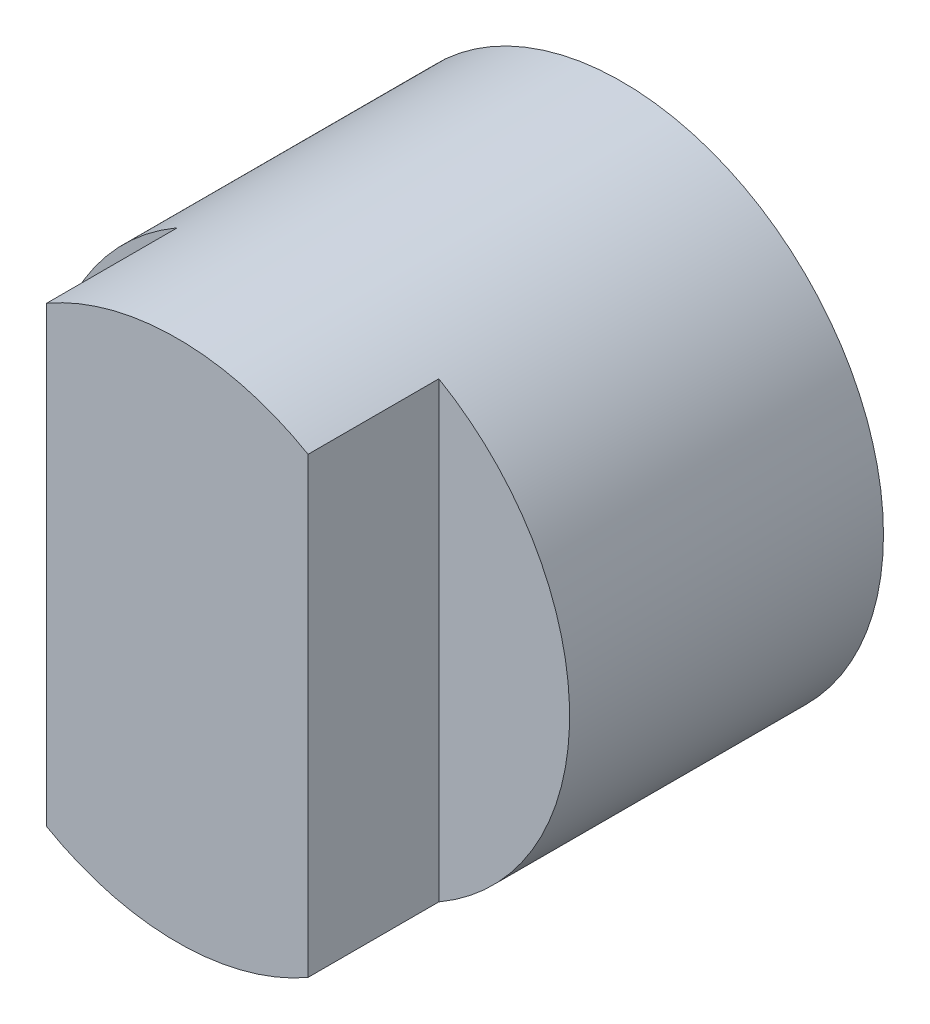
ISO-10303-21;
HEADER;
FILE_DESCRIPTION(('STEP AP214'),'2;1');
FILE_NAME('part.step','',(''),(''),'','','');
FILE_SCHEMA(('AUTOMOTIVE_DESIGN { 1 0 10303 214 1 1 1 1 }'));
ENDSEC;
DATA;
#1=APPLICATION_CONTEXT('core data for automotive mechanical design processes');
#2=APPLICATION_PROTOCOL_DEFINITION('international standard','automotive_design',2000,#1);
#3=PRODUCT_CONTEXT('',#1,'mechanical');
#4=PRODUCT('Part','Part','',(#3));
#5=PRODUCT_RELATED_PRODUCT_CATEGORY('part','',(#4));
#6=PRODUCT_DEFINITION_FORMATION('','',#4);
#7=PRODUCT_DEFINITION_CONTEXT('part definition',#1,'design');
#8=PRODUCT_DEFINITION('design','',#6,#7);
#9=PRODUCT_DEFINITION_SHAPE('','',#8);
#10=(LENGTH_UNIT() NAMED_UNIT(*) SI_UNIT(.MILLI.,.METRE.));
#11=(NAMED_UNIT(*) PLANE_ANGLE_UNIT() SI_UNIT($,.RADIAN.));
#12=(NAMED_UNIT(*) SI_UNIT($,.STERADIAN.) SOLID_ANGLE_UNIT());
#13=UNCERTAINTY_MEASURE_WITH_UNIT(LENGTH_MEASURE(1.E-05),#10,'distance_accuracy_value','');
#14=(GEOMETRIC_REPRESENTATION_CONTEXT(3) GLOBAL_UNCERTAINTY_ASSIGNED_CONTEXT((#13)) GLOBAL_UNIT_ASSIGNED_CONTEXT((#10,
#11,#12)) REPRESENTATION_CONTEXT('',''));
#15=CARTESIAN_POINT('',(0.,0.,0.));
#16=DIRECTION('',(0.,0.,1.));
#17=DIRECTION('',(1.,0.,0.));
#18=AXIS2_PLACEMENT_3D('',#15,#16,#17);
#19=CARTESIAN_POINT('',(0.,0.,17.));
#20=DIRECTION('',(0.,0.,-1.));
#21=DIRECTION('',(-1.,0.,0.));
#22=AXIS2_PLACEMENT_3D('',#19,#20,#21);
#23=CYLINDRICAL_SURFACE('',#22,10.);
#24=CARTESIAN_POINT('',(0.,-10.,8.5));
#25=CARTESIAN_POINT('',(-0.0837515444816421,-9.99999865771297,8.49999654618476));
#26=CARTESIAN_POINT('',(-0.167551685082132,-9.9989368253704,8.49296199915937));
#27=CARTESIAN_POINT('',(-0.332809627994913,-9.99480315973187,8.46501680001725));
#28=CARTESIAN_POINT('',(-0.414265068974229,-9.99172936938473,8.44409263705511));
#29=CARTESIAN_POINT('',(-0.57241808622186,-9.98391721219526,8.38900749503238));
#30=CARTESIAN_POINT('',(-0.649119207826799,-9.97918010370919,8.35485652049405));
#31=CARTESIAN_POINT('',(-0.795690428635254,-9.96856475911724,8.27431162058314));
#32=CARTESIAN_POINT('',(-0.865561474725189,-9.96268668152773,8.22791939558264));
#33=CARTESIAN_POINT('',(-0.997046719562126,-9.95039170991452,8.12382273506013));
#34=CARTESIAN_POINT('',(-1.0585998322255,-9.94397133890331,8.0660415437918));
#35=CARTESIAN_POINT('',(-1.17117490668948,-9.93134261133238,7.94097231110613));
#36=CARTESIAN_POINT('',(-1.22219626272936,-9.92513426698505,7.87368372322148));
#37=CARTESIAN_POINT('',(-1.31249729499943,-9.91359877458726,7.73109935647751));
#38=CARTESIAN_POINT('',(-1.35171787037205,-9.90827611975031,7.65576575301866));
#39=CARTESIAN_POINT('',(-1.41692632171056,-9.89916211306268,7.49948717935457));
#40=CARTESIAN_POINT('',(-1.44291491889163,-9.89537067775449,7.41854251525611));
#41=CARTESIAN_POINT('',(-1.48073198798911,-9.88978256218673,7.25398195812829));
#42=CARTESIAN_POINT('',(-1.49266503640518,-9.8879711574125,7.17039060659198));
#43=CARTESIAN_POINT('',(-1.50235624033932,-9.88650348970582,7.00237383401272));
#44=CARTESIAN_POINT('',(-1.50011520973796,-9.88684710303147,6.91794846113751));
#45=CARTESIAN_POINT('',(-1.48160733250788,-9.88963718352409,6.75139891980586));
#46=CARTESIAN_POINT('',(-1.4654569592775,-9.89206618761549,6.6692614735152));
#47=CARTESIAN_POINT('',(-1.41977117403734,-9.89872608126367,6.50887563112847));
#48=CARTESIAN_POINT('',(-1.39023538337812,-9.90295702179379,6.43062734511926));
#49=CARTESIAN_POINT('',(-1.31849603529736,-9.91276335545481,6.27988662871714));
#50=CARTESIAN_POINT('',(-1.27624314283198,-9.91834396766526,6.20741803090761));
#51=CARTESIAN_POINT('',(-1.18030413128955,-9.93021707574548,6.07055540421807));
#52=CARTESIAN_POINT('',(-1.12661726182478,-9.93650961832501,6.00616190573063));
#53=CARTESIAN_POINT('',(-1.00869493078248,-9.94917473056209,5.88660233926028));
#54=CARTESIAN_POINT('',(-0.944359329642002,-9.95554747112815,5.83153500971366));
#55=CARTESIAN_POINT('',(-0.807307089894187,-9.96759647648462,5.73296406549274));
#56=CARTESIAN_POINT('',(-0.734590414588171,-9.9732727382251,5.6894605014561));
#57=CARTESIAN_POINT('',(-0.582754598213687,-9.98329515585393,5.61524691350045));
#58=CARTESIAN_POINT('',(-0.503631677836781,-9.98764051925428,5.5845445081597));
#59=CARTESIAN_POINT('',(-0.341273182487061,-9.99450490557069,5.53689061031463));
#60=CARTESIAN_POINT('',(-0.258037885952601,-9.99702405195467,5.51993818818443));
#61=CARTESIAN_POINT('',(-0.0906695676436464,-9.99993581133871,5.50039677018331));
#62=CARTESIAN_POINT('',(-0.00655273187047033,-10.0003485209039,5.49767202862068));
#63=CARTESIAN_POINT('',(0.160936677662283,-9.99905561015226,5.50630300531102));
#64=CARTESIAN_POINT('',(0.244309274381877,-9.99735005541369,5.5176582876681));
#65=CARTESIAN_POINT('',(0.407532387431408,-9.99202468615333,5.55401410017754));
#66=CARTESIAN_POINT('',(0.487397963079838,-9.98841415207984,5.57894849603085));
#67=CARTESIAN_POINT('',(0.641814958642999,-9.97968235658369,5.64168499746176));
#68=CARTESIAN_POINT('',(0.716366128795099,-9.97456102421565,5.67948770733363));
#69=CARTESIAN_POINT('',(0.858634979291921,-9.96332682468686,5.76720622456386));
#70=CARTESIAN_POINT('',(0.926299009891566,-9.95720701626745,5.81720814001277));
#71=CARTESIAN_POINT('',(1.05232367317771,-9.94467863012165,5.92778581162874));
#72=CARTESIAN_POINT('',(1.1106837647934,-9.93827003562867,5.98836218232465));
#73=CARTESIAN_POINT('',(1.21693784957195,-9.92582264304494,6.11897353317649));
#74=CARTESIAN_POINT('',(1.26474084747421,-9.91978736017588,6.18908292519477));
#75=CARTESIAN_POINT('',(1.34789129270584,-9.90883219104903,6.33641604051177));
#76=CARTESIAN_POINT('',(1.38323907656436,-9.90391227465628,6.41363957152147));
#77=CARTESIAN_POINT('',(1.44033467323943,-9.89577033008645,6.57273753362313));
#78=CARTESIAN_POINT('',(1.46213037141635,-9.89254233006438,6.65459446097124));
#79=CARTESIAN_POINT('',(1.49165549501586,-9.88813382297802,6.82085901543511));
#80=CARTESIAN_POINT('',(1.49938589183067,-9.88695317451771,6.90526646599467));
#81=CARTESIAN_POINT('',(1.5005378666944,-9.88677832610841,7.07332906331578));
#82=CARTESIAN_POINT('',(1.49410252167313,-9.88776226333502,7.15698324175692));
#83=CARTESIAN_POINT('',(1.46741229544379,-9.89175820611174,7.32200526332352));
#84=CARTESIAN_POINT('',(1.44715743638627,-9.89477020841118,7.40337311011339));
#85=CARTESIAN_POINT('',(1.39345373518665,-9.90247526112297,7.56147308223432));
#86=CARTESIAN_POINT('',(1.36001489324314,-9.90716703716075,7.63820867043344));
#87=CARTESIAN_POINT('',(1.28090667642309,-9.91770454557702,7.7850036338024));
#88=CARTESIAN_POINT('',(1.23523688741502,-9.92355031702724,7.85506278280364));
#89=CARTESIAN_POINT('',(1.13244337659164,-9.93580743364938,7.98724305797517));
#90=CARTESIAN_POINT('',(1.07521369039806,-9.94222367881967,8.04928133324707));
#91=CARTESIAN_POINT('',(0.951148841082835,-9.95485788826636,8.16292455478782));
#92=CARTESIAN_POINT('',(0.884311448350942,-9.96107580610759,8.21452707257616));
#93=CARTESIAN_POINT('',(0.742495707543722,-9.9726518579052,8.30608767660736));
#94=CARTESIAN_POINT('',(0.667474576764762,-9.9780050712882,8.34598010921475));
#95=CARTESIAN_POINT('',(0.51175187024872,-9.98720028802959,8.41253851675805));
#96=CARTESIAN_POINT('',(0.431056277096705,-9.99104385565757,8.43921819005369));
#97=CARTESIAN_POINT('',(0.29166572788933,-9.99590939261505,8.47254134271011));
#98=CARTESIAN_POINT('',(0.23383113349528,-9.99743549179557,8.48282260153881));
#99=CARTESIAN_POINT('',(0.117338971600126,-9.99948125947896,8.49655309771264));
#100=CARTESIAN_POINT('',(0.0586814143344177,-10.0000009404877,8.50000241995255));
#101=CARTESIAN_POINT('',(0.,-10.,8.5));
#102=B_SPLINE_CURVE_WITH_KNOTS('',3,(#24,#25,#26,#27,#28,#29,#30,#31,#32,#33,#34,#35,#36,#37,
#38,#39,#40,#41,#42,#43,#44,#45,#46,#47,#48,#49,#50,#51,#52,#53,#54,#55,#56,#57,#58,#59,#60,#61,
#62,#63,#64,#65,#66,#67,#68,#69,#70,#71,#72,#73,#74,#75,#76,#77,#78,#79,#80,#81,#82,#83,#84,#85,
#86,#87,#88,#89,#90,#91,#92,#93,#94,#95,#96,#97,#98,#99,#100,#101),.UNSPECIFIED.,.T.,.F.,(4,2,2,
2,2,2,2,2,2,2,2,2,2,2,2,2,2,2,2,2,2,2,2,2,2,2,2,2,2,2,2,2,2,2,2,2,2,2,4),(0.,0.251040205031663,
0.50232496292915,0.753420023583238,1.0044802241976,1.25729416136843,1.5101226357258,
1.76419702395375,2.01825756225506,2.27041564605924,2.52255925098982,2.77261177195746,
3.02267136690361,3.27371383476159,3.52477278308534,3.77834291255409,4.03191415238668,
4.28563608984874,4.53934087193401,4.79062058544255,5.04189251991155,5.29195148965948,
5.54202220376273,5.79391188036907,6.0458162002863,6.29981366584672,6.55380426808832,
6.80689223457168,7.05996272137177,7.31048888261064,7.56101464229564,7.81135073984147,
8.0616953146688,8.31444829965721,8.56726003468733,8.82146323384733,9.07540233261441,
9.25129851978808,9.42719252123291),.UNSPECIFIED.);
#103=CARTESIAN_POINT('',(0.,-10.,8.5));
#104=VERTEX_POINT('',#103);
#105=EDGE_CURVE('E103',#104,#104,#102,.T.);
#106=ORIENTED_EDGE('',*,*,#105,.F.);
#107=EDGE_LOOP('',(#106));
#108=FACE_BOUND('',#107,.T.);
#109=CARTESIAN_POINT('',(0.,0.,17.));
#110=DIRECTION('',(0.,0.,1.));
#111=DIRECTION('',(1.,0.,0.));
#112=AXIS2_PLACEMENT_3D('',#109,#110,#111);
#113=CIRCLE('',#112,10.);
#114=CARTESIAN_POINT('',(-5.,-8.66025403784439,17.));
#115=VERTEX_POINT('',#114);
#116=CARTESIAN_POINT('',(5.,-8.66025403784439,17.));
#117=VERTEX_POINT('',#116);
#118=EDGE_CURVE('E38',#115,#117,#113,.T.);
#119=ORIENTED_EDGE('',*,*,#118,.F.);
#120=DIRECTION('',(0.,0.,1.));
#121=VECTOR('',#120,1.);
#122=CARTESIAN_POINT('',(-5.,-8.66025403784439,12.));
#123=LINE('',#122,#121);
#124=CARTESIAN_POINT('',(-5.,-8.66025403784439,12.));
#125=VERTEX_POINT('',#124);
#126=EDGE_CURVE('E53',#125,#115,#123,.T.);
#127=ORIENTED_EDGE('',*,*,#126,.F.);
#128=CARTESIAN_POINT('',(0.,0.,12.));
#129=DIRECTION('',(0.,0.,1.));
#130=DIRECTION('',(1.,0.,0.));
#131=AXIS2_PLACEMENT_3D('',#128,#129,#130);
#132=CIRCLE('',#131,10.);
#133=CARTESIAN_POINT('',(-5.,8.66025403784439,12.));
#134=VERTEX_POINT('',#133);
#135=EDGE_CURVE('E107',#134,#125,#132,.T.);
#136=ORIENTED_EDGE('',*,*,#135,.F.);
#137=DIRECTION('',(0.,0.,1.));
#138=VECTOR('',#137,1.);
#139=CARTESIAN_POINT('',(-5.,8.66025403784439,12.));
#140=LINE('',#139,#138);
#141=CARTESIAN_POINT('',(-5.,8.66025403784439,17.));
#142=VERTEX_POINT('',#141);
#143=EDGE_CURVE('E113',#134,#142,#140,.T.);
#144=ORIENTED_EDGE('',*,*,#143,.T.);
#145=CARTESIAN_POINT('',(5.,8.66025403784439,17.));
#146=VERTEX_POINT('',#145);
#147=EDGE_CURVE('E11',#146,#142,#113,.T.);
#148=ORIENTED_EDGE('',*,*,#147,.F.);
#149=DIRECTION('',(0.,0.,1.));
#150=VECTOR('',#149,1.);
#151=CARTESIAN_POINT('',(5.,8.66025403784439,12.));
#152=LINE('',#151,#150);
#153=CARTESIAN_POINT('',(5.,8.66025403784439,12.));
#154=VERTEX_POINT('',#153);
#155=EDGE_CURVE('E123',#154,#146,#152,.T.);
#156=ORIENTED_EDGE('',*,*,#155,.F.);
#157=CARTESIAN_POINT('',(0.,0.,12.));
#158=DIRECTION('',(0.,0.,1.));
#159=DIRECTION('',(1.,0.,0.));
#160=AXIS2_PLACEMENT_3D('',#157,#158,#159);
#161=CIRCLE('',#160,10.);
#162=CARTESIAN_POINT('',(5.,-8.66025403784439,12.));
#163=VERTEX_POINT('',#162);
#164=EDGE_CURVE('E118',#163,#154,#161,.T.);
#165=ORIENTED_EDGE('',*,*,#164,.F.);
#166=DIRECTION('',(0.,0.,1.));
#167=VECTOR('',#166,1.);
#168=CARTESIAN_POINT('',(5.,-8.66025403784439,12.));
#169=LINE('',#168,#167);
#170=EDGE_CURVE('E126',#163,#117,#169,.T.);
#171=ORIENTED_EDGE('',*,*,#170,.T.);
#172=EDGE_LOOP('',(#119,#127,#136,#144,#148,#156,#165,#171));
#173=FACE_BOUND('',#172,.T.);
#174=CARTESIAN_POINT('',(0.,0.,0.));
#175=DIRECTION('',(0.,0.,1.));
#176=DIRECTION('',(1.,0.,0.));
#177=AXIS2_PLACEMENT_3D('',#174,#175,#176);
#178=CIRCLE('',#177,10.);
#179=CARTESIAN_POINT('',(10.,0.,0.));
#180=VERTEX_POINT('',#179);
#181=EDGE_CURVE('E33',#180,#180,#178,.T.);
#182=ORIENTED_EDGE('',*,*,#181,.T.);
#183=EDGE_LOOP('',(#182));
#184=FACE_BOUND('',#183,.T.);
#185=ADVANCED_FACE('F30',(#108,#173,#184),#23,.T.);
#186=CARTESIAN_POINT('',(0.,0.,17.));
#187=DIRECTION('',(0.,0.,1.));
#188=DIRECTION('',(1.,0.,0.));
#189=AXIS2_PLACEMENT_3D('',#186,#187,#188);
#190=PLANE('',#189);
#191=DIRECTION('',(0.,1.,0.));
#192=VECTOR('',#191,1.);
#193=CARTESIAN_POINT('',(-5.,8.66025403784439,17.));
#194=LINE('',#193,#192);
#195=EDGE_CURVE('E105',#115,#142,#194,.T.);
#196=ORIENTED_EDGE('',*,*,#195,.F.);
#197=ORIENTED_EDGE('',*,*,#118,.T.);
#198=DIRECTION('',(0.,-1.,0.));
#199=VECTOR('',#198,1.);
#200=CARTESIAN_POINT('',(5.,8.66025403784439,17.));
#201=LINE('',#200,#199);
#202=EDGE_CURVE('E116',#146,#117,#201,.T.);
#203=ORIENTED_EDGE('',*,*,#202,.F.);
#204=ORIENTED_EDGE('',*,*,#147,.T.);
#205=EDGE_LOOP('',(#196,#197,#203,#204));
#206=FACE_BOUND('',#205,.T.);
#207=ADVANCED_FACE('F138',(#206),#190,.T.);
#208=CARTESIAN_POINT('',(0.,0.,0.));
#209=DIRECTION('',(0.,0.,1.));
#210=DIRECTION('',(1.,0.,0.));
#211=AXIS2_PLACEMENT_3D('',#208,#209,#210);
#212=PLANE('',#211);
#213=DIRECTION('',(-1.,0.,0.));
#214=VECTOR('',#213,1.);
#215=CARTESIAN_POINT('',(0.,-2.725,0.));
#216=LINE('',#215,#214);
#217=CARTESIAN_POINT('',(1.62941707368003,-2.725,0.));
#218=VERTEX_POINT('',#217);
#219=CARTESIAN_POINT('',(-1.62941707368003,-2.725,0.));
#220=VERTEX_POINT('',#219);
#221=EDGE_CURVE('E95',#218,#220,#216,.T.);
#222=ORIENTED_EDGE('',*,*,#221,.F.);
#223=CARTESIAN_POINT('',(0.,0.,0.));
#224=DIRECTION('',(0.,0.,-1.));
#225=DIRECTION('',(-1.,0.,0.));
#226=AXIS2_PLACEMENT_3D('',#223,#224,#225);
#227=CIRCLE('',#226,3.175);
#228=EDGE_CURVE('E45',#220,#218,#227,.T.);
#229=ORIENTED_EDGE('',*,*,#228,.F.);
#230=EDGE_LOOP('',(#222,#229));
#231=FACE_BOUND('',#230,.T.);
#232=ORIENTED_EDGE('',*,*,#181,.F.);
#233=EDGE_LOOP('',(#232));
#234=FACE_BOUND('',#233,.T.);
#235=ADVANCED_FACE('F160',(#231,#234),#212,.F.);
#236=CARTESIAN_POINT('',(5.,8.66025403784439,12.));
#237=DIRECTION('',(-1.,0.,0.));
#238=DIRECTION('',(0.,0.,1.));
#239=AXIS2_PLACEMENT_3D('',#236,#237,#238);
#240=PLANE('',#239);
#241=ORIENTED_EDGE('',*,*,#202,.T.);
#242=ORIENTED_EDGE('',*,*,#170,.F.);
#243=DIRECTION('',(0.,-1.,0.));
#244=VECTOR('',#243,1.);
#245=CARTESIAN_POINT('',(5.,8.66025403784439,12.));
#246=LINE('',#245,#244);
#247=EDGE_CURVE('E120',#154,#163,#246,.T.);
#248=ORIENTED_EDGE('',*,*,#247,.F.);
#249=ORIENTED_EDGE('',*,*,#155,.T.);
#250=EDGE_LOOP('',(#241,#242,#248,#249));
#251=FACE_BOUND('',#250,.T.);
#252=ADVANCED_FACE('F133',(#251),#240,.F.);
#253=CARTESIAN_POINT('',(0.,0.,12.));
#254=DIRECTION('',(0.,0.,1.));
#255=DIRECTION('',(1.,0.,0.));
#256=AXIS2_PLACEMENT_3D('',#253,#254,#255);
#257=PLANE('',#256);
#258=ORIENTED_EDGE('',*,*,#164,.T.);
#259=ORIENTED_EDGE('',*,*,#247,.T.);
#260=EDGE_LOOP('',(#258,#259));
#261=FACE_BOUND('',#260,.T.);
#262=ADVANCED_FACE('F152',(#261),#257,.T.);
#263=CARTESIAN_POINT('',(-5.,8.66025403784439,12.));
#264=DIRECTION('',(1.,0.,0.));
#265=DIRECTION('',(0.,0.,-1.));
#266=AXIS2_PLACEMENT_3D('',#263,#264,#265);
#267=PLANE('',#266);
#268=ORIENTED_EDGE('',*,*,#195,.T.);
#269=ORIENTED_EDGE('',*,*,#143,.F.);
#270=DIRECTION('',(0.,1.,0.));
#271=VECTOR('',#270,1.);
#272=CARTESIAN_POINT('',(-5.,8.66025403784439,12.));
#273=LINE('',#272,#271);
#274=EDGE_CURVE('E109',#125,#134,#273,.T.);
#275=ORIENTED_EDGE('',*,*,#274,.F.);
#276=ORIENTED_EDGE('',*,*,#126,.T.);
#277=EDGE_LOOP('',(#268,#269,#275,#276));
#278=FACE_BOUND('',#277,.T.);
#279=ADVANCED_FACE('F142',(#278),#267,.F.);
#280=CARTESIAN_POINT('',(0.,0.,12.));
#281=DIRECTION('',(0.,0.,1.));
#282=DIRECTION('',(1.,0.,0.));
#283=AXIS2_PLACEMENT_3D('',#280,#281,#282);
#284=PLANE('',#283);
#285=ORIENTED_EDGE('',*,*,#135,.T.);
#286=ORIENTED_EDGE('',*,*,#274,.T.);
#287=EDGE_LOOP('',(#285,#286));
#288=FACE_BOUND('',#287,.T.);
#289=ADVANCED_FACE('F144',(#288),#284,.T.);
#290=CARTESIAN_POINT('',(0.,0.,15.));
#291=DIRECTION('',(0.,0.,-1.));
#292=DIRECTION('',(-1.,0.,0.));
#293=AXIS2_PLACEMENT_3D('',#290,#291,#292);
#294=CYLINDRICAL_SURFACE('',#293,3.175);
#295=ORIENTED_EDGE('',*,*,#228,.T.);
#296=DIRECTION('',(0.,0.,-1.));
#297=VECTOR('',#296,1.);
#298=CARTESIAN_POINT('',(1.62941707368003,-2.725,15.));
#299=LINE('',#298,#297);
#300=CARTESIAN_POINT('',(1.62941707368003,-2.725,15.));
#301=VERTEX_POINT('',#300);
#302=EDGE_CURVE('E96',#301,#218,#299,.T.);
#303=ORIENTED_EDGE('',*,*,#302,.F.);
#304=CARTESIAN_POINT('',(0.,0.,15.));
#305=DIRECTION('',(0.,0.,-1.));
#306=DIRECTION('',(-1.,0.,0.));
#307=AXIS2_PLACEMENT_3D('',#304,#305,#306);
#308=CIRCLE('',#307,3.175);
#309=CARTESIAN_POINT('',(-1.62941707368003,-2.725,15.));
#310=VERTEX_POINT('',#309);
#311=EDGE_CURVE('E88',#310,#301,#308,.T.);
#312=ORIENTED_EDGE('',*,*,#311,.F.);
#313=DIRECTION('',(0.,0.,-1.));
#314=VECTOR('',#313,1.);
#315=CARTESIAN_POINT('',(-1.62941707368003,-2.725,15.));
#316=LINE('',#315,#314);
#317=EDGE_CURVE('E92',#310,#220,#316,.T.);
#318=ORIENTED_EDGE('',*,*,#317,.T.);
#319=EDGE_LOOP('',(#295,#303,#312,#318));
#320=FACE_BOUND('',#319,.T.);
#321=ADVANCED_FACE('F98',(#320),#294,.F.);
#322=CARTESIAN_POINT('',(0.,-2.725,15.));
#323=DIRECTION('',(0.,-1.,0.));
#324=DIRECTION('',(0.,0.,-1.));
#325=AXIS2_PLACEMENT_3D('',#322,#323,#324);
#326=PLANE('',#325);
#327=CARTESIAN_POINT('',(0.,-2.725,7.));
#328=DIRECTION('',(0.,1.,0.));
#329=DIRECTION('',(0.,0.,1.));
#330=AXIS2_PLACEMENT_3D('',#327,#328,#329);
#331=CIRCLE('',#330,1.5);
#332=CARTESIAN_POINT('',(0.,-2.725,8.5));
#333=VERTEX_POINT('',#332);
#334=EDGE_CURVE('E165',#333,#333,#331,.T.);
#335=ORIENTED_EDGE('',*,*,#334,.F.);
#336=EDGE_LOOP('',(#335));
#337=FACE_BOUND('',#336,.T.);
#338=ORIENTED_EDGE('',*,*,#221,.T.);
#339=ORIENTED_EDGE('',*,*,#317,.F.);
#340=DIRECTION('',(-1.,0.,0.));
#341=VECTOR('',#340,1.);
#342=CARTESIAN_POINT('',(1.62941707368003,-2.725,15.));
#343=LINE('',#342,#341);
#344=EDGE_CURVE('E84',#301,#310,#343,.T.);
#345=ORIENTED_EDGE('',*,*,#344,.F.);
#346=ORIENTED_EDGE('',*,*,#302,.T.);
#347=EDGE_LOOP('',(#338,#339,#345,#346));
#348=FACE_BOUND('',#347,.T.);
#349=ADVANCED_FACE('F93',(#337,#348),#326,.F.);
#350=CARTESIAN_POINT('',(0.,0.,15.));
#351=DIRECTION('',(0.,0.,-1.));
#352=DIRECTION('',(-1.,0.,0.));
#353=AXIS2_PLACEMENT_3D('',#350,#351,#352);
#354=PLANE('',#353);
#355=ORIENTED_EDGE('',*,*,#344,.T.);
#356=ORIENTED_EDGE('',*,*,#311,.T.);
#357=EDGE_LOOP('',(#355,#356));
#358=FACE_BOUND('',#357,.T.);
#359=ADVANCED_FACE('F86',(#358),#354,.T.);
#360=CARTESIAN_POINT('',(0.,-10.001,7.));
#361=DIRECTION('',(0.,1.,0.));
#362=DIRECTION('',(0.,0.,1.));
#363=AXIS2_PLACEMENT_3D('',#360,#361,#362);
#364=CYLINDRICAL_SURFACE('',#363,1.5);
#365=ORIENTED_EDGE('',*,*,#334,.T.);
#366=EDGE_LOOP('',(#365));
#367=FACE_BOUND('',#366,.T.);
#368=ORIENTED_EDGE('',*,*,#105,.T.);
#369=EDGE_LOOP('',(#368));
#370=FACE_BOUND('',#369,.T.);
#371=ADVANCED_FACE('F172',(#367,#370),#364,.F.);
#372=CLOSED_SHELL('',(#185,#207,#235,#252,#262,#279,#289,#321,#349,#359,#371));
#373=MANIFOLD_SOLID_BREP('B2',#372);
#374=ADVANCED_BREP_SHAPE_REPRESENTATION('',(#18,#373),#14);
#375=SHAPE_DEFINITION_REPRESENTATION(#9,#374);
ENDSEC;
END-ISO-10303-21;
